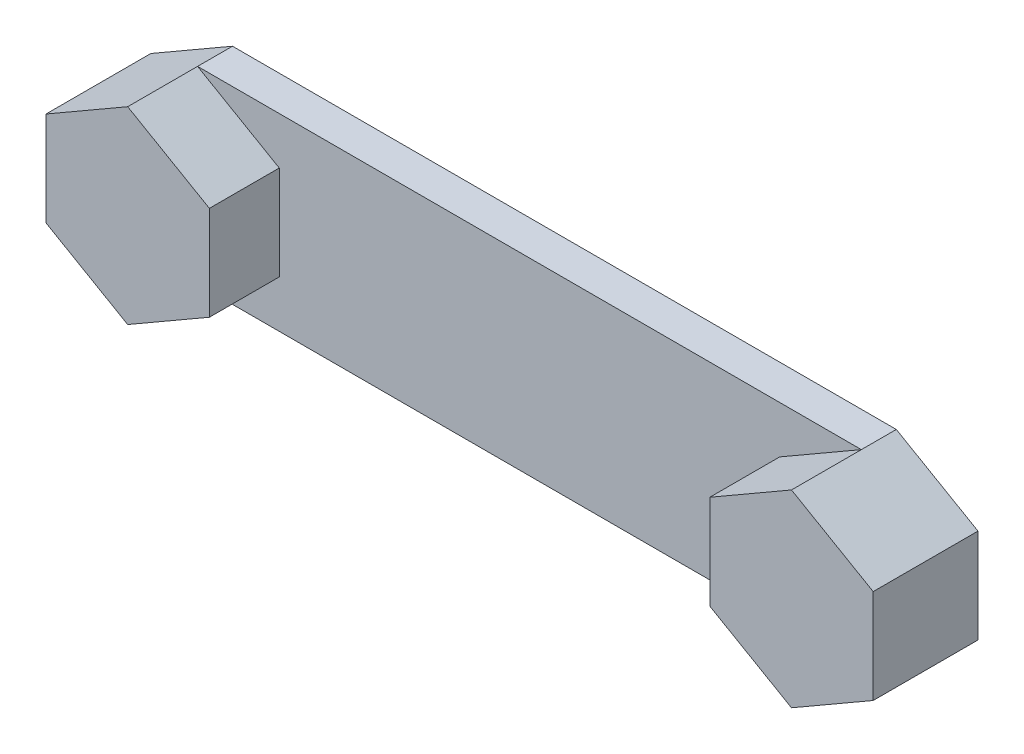
ISO-10303-21;
HEADER;
FILE_DESCRIPTION(('STEP AP214'),'2;1');
FILE_NAME('part.step','',(''),(''),'','','');
FILE_SCHEMA(('AUTOMOTIVE_DESIGN { 1 0 10303 214 1 1 1 1 }'));
ENDSEC;
DATA;
#1=APPLICATION_CONTEXT('core data for automotive mechanical design processes');
#2=APPLICATION_PROTOCOL_DEFINITION('international standard','automotive_design',2000,#1);
#3=PRODUCT_CONTEXT('',#1,'mechanical');
#4=PRODUCT('Part','Part','',(#3));
#5=PRODUCT_RELATED_PRODUCT_CATEGORY('part','',(#4));
#6=PRODUCT_DEFINITION_FORMATION('','',#4);
#7=PRODUCT_DEFINITION_CONTEXT('part definition',#1,'design');
#8=PRODUCT_DEFINITION('design','',#6,#7);
#9=PRODUCT_DEFINITION_SHAPE('','',#8);
#10=(LENGTH_UNIT() NAMED_UNIT(*) SI_UNIT(.MILLI.,.METRE.));
#11=(NAMED_UNIT(*) PLANE_ANGLE_UNIT() SI_UNIT($,.RADIAN.));
#12=(NAMED_UNIT(*) SI_UNIT($,.STERADIAN.) SOLID_ANGLE_UNIT());
#13=UNCERTAINTY_MEASURE_WITH_UNIT(LENGTH_MEASURE(1.E-05),#10,'distance_accuracy_value','');
#14=(GEOMETRIC_REPRESENTATION_CONTEXT(3) GLOBAL_UNCERTAINTY_ASSIGNED_CONTEXT((#13)) GLOBAL_UNIT_ASSIGNED_CONTEXT((#10,
#11,#12)) REPRESENTATION_CONTEXT('',''));
#15=CARTESIAN_POINT('',(0.,0.,0.));
#16=DIRECTION('',(0.,0.,1.));
#17=DIRECTION('',(1.,0.,0.));
#18=AXIS2_PLACEMENT_3D('',#15,#16,#17);
#19=CARTESIAN_POINT('',(0.,0.,0.));
#20=DIRECTION('',(0.,0.,-1.));
#21=DIRECTION('',(-1.,0.,0.));
#22=AXIS2_PLACEMENT_3D('',#19,#20,#21);
#23=PLANE('',#22);
#24=DIRECTION('',(0.866025403784438,-0.500000000000001,0.));
#25=VECTOR('',#24,1.);
#26=CARTESIAN_POINT('',(57.,-8.10000000000003,0.));
#27=LINE('',#26,#25);
#28=CARTESIAN_POINT('',(49.985194229346,-4.05000000000002,0.));
#29=VERTEX_POINT('',#28);
#30=CARTESIAN_POINT('',(57.,-8.10000000000003,0.));
#31=VERTEX_POINT('',#30);
#32=EDGE_CURVE('E61',#29,#31,#27,.T.);
#33=ORIENTED_EDGE('',*,*,#32,.F.);
#34=DIRECTION('',(0.,-1.,0.));
#35=VECTOR('',#34,1.);
#36=CARTESIAN_POINT('',(49.985194229346,-4.05000000000002,0.));
#37=LINE('',#36,#35);
#38=CARTESIAN_POINT('',(49.985194229346,4.05,0.));
#39=VERTEX_POINT('',#38);
#40=EDGE_CURVE('E298',#39,#29,#37,.T.);
#41=ORIENTED_EDGE('',*,*,#40,.F.);
#42=DIRECTION('',(-0.866025403784438,-0.500000000000001,0.));
#43=VECTOR('',#42,1.);
#44=CARTESIAN_POINT('',(49.985194229346,4.05,0.));
#45=LINE('',#44,#43);
#46=CARTESIAN_POINT('',(57.,8.10000000000001,0.));
#47=VERTEX_POINT('',#46);
#48=EDGE_CURVE('E297',#47,#39,#45,.T.);
#49=ORIENTED_EDGE('',*,*,#48,.F.);
#50=DIRECTION('',(1.,0.,0.));
#51=VECTOR('',#50,1.);
#52=CARTESIAN_POINT('',(0.,8.1,0.));
#53=LINE('',#52,#51);
#54=CARTESIAN_POINT('',(0.,8.1,0.));
#55=VERTEX_POINT('',#54);
#56=EDGE_CURVE('E207',#55,#47,#53,.T.);
#57=ORIENTED_EDGE('',*,*,#56,.F.);
#58=DIRECTION('',(-0.866025403784439,0.5,0.));
#59=VECTOR('',#58,1.);
#60=CARTESIAN_POINT('',(7.01480577065395,4.05,0.));
#61=LINE('',#60,#59);
#62=CARTESIAN_POINT('',(7.01480577065395,4.05,0.));
#63=VERTEX_POINT('',#62);
#64=EDGE_CURVE('E91',#63,#55,#61,.T.);
#65=ORIENTED_EDGE('',*,*,#64,.F.);
#66=DIRECTION('',(0.,1.,0.));
#67=VECTOR('',#66,1.);
#68=CARTESIAN_POINT('',(7.01480577065396,-4.05,0.));
#69=LINE('',#68,#67);
#70=CARTESIAN_POINT('',(7.01480577065396,-4.05,0.));
#71=VERTEX_POINT('',#70);
#72=EDGE_CURVE('E82',#71,#63,#69,.T.);
#73=ORIENTED_EDGE('',*,*,#72,.F.);
#74=DIRECTION('',(0.866025403784439,0.5,0.));
#75=VECTOR('',#74,1.);
#76=CARTESIAN_POINT('',(0.,-8.1,0.));
#77=LINE('',#76,#75);
#78=CARTESIAN_POINT('',(0.,-8.1,0.));
#79=VERTEX_POINT('',#78);
#80=EDGE_CURVE('E143',#79,#71,#77,.T.);
#81=ORIENTED_EDGE('',*,*,#80,.F.);
#82=DIRECTION('',(1.,0.,0.));
#83=VECTOR('',#82,1.);
#84=CARTESIAN_POINT('',(0.,-8.1,0.));
#85=LINE('',#84,#83);
#86=EDGE_CURVE('E204',#79,#31,#85,.T.);
#87=ORIENTED_EDGE('',*,*,#86,.T.);
#88=EDGE_LOOP('',(#33,#41,#49,#57,#65,#73,#81,#87));
#89=FACE_BOUND('',#88,.T.);
#90=ADVANCED_FACE('F45',(#89),#23,.F.);
#91=CARTESIAN_POINT('',(7.01480577065395,4.05,6.));
#92=DIRECTION('',(-0.5,-0.866025403784439,0.));
#93=DIRECTION('',(0.866025403784439,-0.5,0.));
#94=AXIS2_PLACEMENT_3D('',#91,#92,#93);
#95=PLANE('',#94);
#96=ORIENTED_EDGE('',*,*,#64,.T.);
#97=DIRECTION('',(0.,0.,-1.));
#98=VECTOR('',#97,1.);
#99=CARTESIAN_POINT('',(0.,8.1,6.));
#100=LINE('',#99,#98);
#101=CARTESIAN_POINT('',(0.,8.1,6.));
#102=VERTEX_POINT('',#101);
#103=EDGE_CURVE('E11',#102,#55,#100,.T.);
#104=ORIENTED_EDGE('',*,*,#103,.F.);
#105=DIRECTION('',(-0.866025403784439,0.5,0.));
#106=VECTOR('',#105,1.);
#107=CARTESIAN_POINT('',(7.01480577065395,4.05,6.));
#108=LINE('',#107,#106);
#109=CARTESIAN_POINT('',(7.01480577065395,4.05,6.));
#110=VERTEX_POINT('',#109);
#111=EDGE_CURVE('E148',#110,#102,#108,.T.);
#112=ORIENTED_EDGE('',*,*,#111,.F.);
#113=DIRECTION('',(0.,0.,-1.));
#114=VECTOR('',#113,1.);
#115=CARTESIAN_POINT('',(7.01480577065395,4.05,6.));
#116=LINE('',#115,#114);
#117=EDGE_CURVE('E137',#110,#63,#116,.T.);
#118=ORIENTED_EDGE('',*,*,#117,.T.);
#119=EDGE_LOOP('',(#96,#104,#112,#118));
#120=FACE_BOUND('',#119,.T.);
#121=ADVANCED_FACE('F47',(#120),#95,.F.);
#122=CARTESIAN_POINT('',(0.,8.1,6.));
#123=DIRECTION('',(0.5,-0.866025403784439,0.));
#124=DIRECTION('',(0.866025403784439,0.5,0.));
#125=AXIS2_PLACEMENT_3D('',#122,#123,#124);
#126=PLANE('',#125);
#127=ORIENTED_EDGE('',*,*,#103,.T.);
#128=DIRECTION('',(0.,0.,1.));
#129=VECTOR('',#128,1.);
#130=CARTESIAN_POINT('',(0.,8.1,-3.));
#131=LINE('',#130,#129);
#132=CARTESIAN_POINT('',(0.,8.1,-3.));
#133=VERTEX_POINT('',#132);
#134=EDGE_CURVE('E182',#133,#55,#131,.T.);
#135=ORIENTED_EDGE('',*,*,#134,.F.);
#136=DIRECTION('',(0.866025403784439,0.5,0.));
#137=VECTOR('',#136,1.);
#138=CARTESIAN_POINT('',(-3.50740288532698,6.075,-3.));
#139=LINE('',#138,#137);
#140=CARTESIAN_POINT('',(-7.01480577065396,4.05,-3.));
#141=VERTEX_POINT('',#140);
#142=EDGE_CURVE('E175',#141,#133,#139,.T.);
#143=ORIENTED_EDGE('',*,*,#142,.F.);
#144=DIRECTION('',(0.,0.,-1.));
#145=VECTOR('',#144,1.);
#146=CARTESIAN_POINT('',(-7.01480577065396,4.05,6.));
#147=LINE('',#146,#145);
#148=CARTESIAN_POINT('',(-7.01480577065396,4.05,6.));
#149=VERTEX_POINT('',#148);
#150=EDGE_CURVE('E54',#149,#141,#147,.T.);
#151=ORIENTED_EDGE('',*,*,#150,.F.);
#152=DIRECTION('',(-0.866025403784439,-0.5,0.));
#153=VECTOR('',#152,1.);
#154=CARTESIAN_POINT('',(0.,8.1,6.));
#155=LINE('',#154,#153);
#156=EDGE_CURVE('E234',#102,#149,#155,.T.);
#157=ORIENTED_EDGE('',*,*,#156,.F.);
#158=EDGE_LOOP('',(#127,#135,#143,#151,#157));
#159=FACE_BOUND('',#158,.T.);
#160=ADVANCED_FACE('F180',(#159),#126,.F.);
#161=CARTESIAN_POINT('',(-7.01480577065396,4.05,6.));
#162=DIRECTION('',(1.,0.,0.));
#163=DIRECTION('',(0.,1.,0.));
#164=AXIS2_PLACEMENT_3D('',#161,#162,#163);
#165=PLANE('',#164);
#166=ORIENTED_EDGE('',*,*,#150,.T.);
#167=DIRECTION('',(0.,1.,0.));
#168=VECTOR('',#167,1.);
#169=CARTESIAN_POINT('',(-7.01480577065396,0.,-3.));
#170=LINE('',#169,#168);
#171=CARTESIAN_POINT('',(-7.01480577065396,-4.05,-3.));
#172=VERTEX_POINT('',#171);
#173=EDGE_CURVE('E164',#172,#141,#170,.T.);
#174=ORIENTED_EDGE('',*,*,#173,.F.);
#175=DIRECTION('',(0.,0.,-1.));
#176=VECTOR('',#175,1.);
#177=CARTESIAN_POINT('',(-7.01480577065395,-4.05,6.));
#178=LINE('',#177,#176);
#179=CARTESIAN_POINT('',(-7.01480577065395,-4.05,6.));
#180=VERTEX_POINT('',#179);
#181=EDGE_CURVE('E129',#180,#172,#178,.T.);
#182=ORIENTED_EDGE('',*,*,#181,.F.);
#183=DIRECTION('',(0.,-1.,0.));
#184=VECTOR('',#183,1.);
#185=CARTESIAN_POINT('',(-7.01480577065396,4.05,6.));
#186=LINE('',#185,#184);
#187=EDGE_CURVE('E112',#149,#180,#186,.T.);
#188=ORIENTED_EDGE('',*,*,#187,.F.);
#189=EDGE_LOOP('',(#166,#174,#182,#188));
#190=FACE_BOUND('',#189,.T.);
#191=ADVANCED_FACE('F162',(#190),#165,.F.);
#192=CARTESIAN_POINT('',(-7.01480577065395,-4.05,6.));
#193=DIRECTION('',(0.5,0.866025403784439,0.));
#194=DIRECTION('',(-0.866025403784439,0.5,0.));
#195=AXIS2_PLACEMENT_3D('',#192,#193,#194);
#196=PLANE('',#195);
#197=ORIENTED_EDGE('',*,*,#181,.T.);
#198=DIRECTION('',(-0.866025403784439,0.5,0.));
#199=VECTOR('',#198,1.);
#200=CARTESIAN_POINT('',(-3.50740288532698,-6.075,-3.));
#201=LINE('',#200,#199);
#202=CARTESIAN_POINT('',(0.,-8.1,-3.));
#203=VERTEX_POINT('',#202);
#204=EDGE_CURVE('E177',#203,#172,#201,.T.);
#205=ORIENTED_EDGE('',*,*,#204,.F.);
#206=DIRECTION('',(0.,0.,1.));
#207=VECTOR('',#206,1.);
#208=CARTESIAN_POINT('',(0.,-8.1,-3.));
#209=LINE('',#208,#207);
#210=EDGE_CURVE('E125',#203,#79,#209,.T.);
#211=ORIENTED_EDGE('',*,*,#210,.T.);
#212=DIRECTION('',(0.,0.,-1.));
#213=VECTOR('',#212,1.);
#214=CARTESIAN_POINT('',(0.,-8.1,6.));
#215=LINE('',#214,#213);
#216=CARTESIAN_POINT('',(0.,-8.1,6.));
#217=VERTEX_POINT('',#216);
#218=EDGE_CURVE('E120',#217,#79,#215,.T.);
#219=ORIENTED_EDGE('',*,*,#218,.F.);
#220=DIRECTION('',(0.866025403784439,-0.5,0.));
#221=VECTOR('',#220,1.);
#222=CARTESIAN_POINT('',(-7.01480577065395,-4.05,6.));
#223=LINE('',#222,#221);
#224=EDGE_CURVE('E105',#180,#217,#223,.T.);
#225=ORIENTED_EDGE('',*,*,#224,.F.);
#226=EDGE_LOOP('',(#197,#205,#211,#219,#225));
#227=FACE_BOUND('',#226,.T.);
#228=ADVANCED_FACE('F121',(#227),#196,.F.);
#229=CARTESIAN_POINT('',(0.,-8.1,6.));
#230=DIRECTION('',(-0.5,0.866025403784438,0.));
#231=DIRECTION('',(-0.866025403784439,-0.5,0.));
#232=AXIS2_PLACEMENT_3D('',#229,#230,#231);
#233=PLANE('',#232);
#234=ORIENTED_EDGE('',*,*,#80,.T.);
#235=DIRECTION('',(0.,0.,-1.));
#236=VECTOR('',#235,1.);
#237=CARTESIAN_POINT('',(7.01480577065396,-4.05,6.));
#238=LINE('',#237,#236);
#239=CARTESIAN_POINT('',(7.01480577065396,-4.05,6.));
#240=VERTEX_POINT('',#239);
#241=EDGE_CURVE('E130',#240,#71,#238,.T.);
#242=ORIENTED_EDGE('',*,*,#241,.F.);
#243=DIRECTION('',(0.866025403784439,0.5,0.));
#244=VECTOR('',#243,1.);
#245=CARTESIAN_POINT('',(0.,-8.1,6.));
#246=LINE('',#245,#244);
#247=EDGE_CURVE('E109',#217,#240,#246,.T.);
#248=ORIENTED_EDGE('',*,*,#247,.F.);
#249=ORIENTED_EDGE('',*,*,#218,.T.);
#250=EDGE_LOOP('',(#234,#242,#248,#249));
#251=FACE_BOUND('',#250,.T.);
#252=ADVANCED_FACE('F132',(#251),#233,.F.);
#253=CARTESIAN_POINT('',(7.01480577065396,-4.05,6.));
#254=DIRECTION('',(-1.,0.,0.));
#255=DIRECTION('',(0.,-1.,0.));
#256=AXIS2_PLACEMENT_3D('',#253,#254,#255);
#257=PLANE('',#256);
#258=ORIENTED_EDGE('',*,*,#72,.T.);
#259=ORIENTED_EDGE('',*,*,#117,.F.);
#260=DIRECTION('',(0.,1.,0.));
#261=VECTOR('',#260,1.);
#262=CARTESIAN_POINT('',(7.01480577065396,-4.05,6.));
#263=LINE('',#262,#261);
#264=EDGE_CURVE('E70',#240,#110,#263,.T.);
#265=ORIENTED_EDGE('',*,*,#264,.F.);
#266=ORIENTED_EDGE('',*,*,#241,.T.);
#267=EDGE_LOOP('',(#258,#259,#265,#266));
#268=FACE_BOUND('',#267,.T.);
#269=ADVANCED_FACE('F244',(#268),#257,.F.);
#270=CARTESIAN_POINT('',(0.,0.,6.));
#271=DIRECTION('',(0.,0.,1.));
#272=DIRECTION('',(1.,0.,0.));
#273=AXIS2_PLACEMENT_3D('',#270,#271,#272);
#274=PLANE('',#273);
#275=ORIENTED_EDGE('',*,*,#111,.T.);
#276=ORIENTED_EDGE('',*,*,#156,.T.);
#277=ORIENTED_EDGE('',*,*,#187,.T.);
#278=ORIENTED_EDGE('',*,*,#224,.T.);
#279=ORIENTED_EDGE('',*,*,#247,.T.);
#280=ORIENTED_EDGE('',*,*,#264,.T.);
#281=EDGE_LOOP('',(#275,#276,#277,#278,#279,#280));
#282=FACE_BOUND('',#281,.T.);
#283=ADVANCED_FACE('F107',(#282),#274,.T.);
#284=CARTESIAN_POINT('',(0.,-8.1,-3.));
#285=DIRECTION('',(0.,-1.,0.));
#286=DIRECTION('',(1.,0.,0.));
#287=AXIS2_PLACEMENT_3D('',#284,#285,#286);
#288=PLANE('',#287);
#289=ORIENTED_EDGE('',*,*,#86,.F.);
#290=ORIENTED_EDGE('',*,*,#210,.F.);
#291=DIRECTION('',(1.,0.,0.));
#292=VECTOR('',#291,1.);
#293=CARTESIAN_POINT('',(0.,-8.1,-3.));
#294=LINE('',#293,#292);
#295=CARTESIAN_POINT('',(57.,-8.10000000000003,-3.));
#296=VERTEX_POINT('',#295);
#297=EDGE_CURVE('E212',#203,#296,#294,.T.);
#298=ORIENTED_EDGE('',*,*,#297,.T.);
#299=DIRECTION('',(0.,0.,1.));
#300=VECTOR('',#299,1.);
#301=CARTESIAN_POINT('',(57.,-8.10000000000003,-3.));
#302=LINE('',#301,#300);
#303=EDGE_CURVE('E203',#296,#31,#302,.T.);
#304=ORIENTED_EDGE('',*,*,#303,.T.);
#305=EDGE_LOOP('',(#289,#290,#298,#304));
#306=FACE_BOUND('',#305,.T.);
#307=ADVANCED_FACE('F251',(#306),#288,.T.);
#308=CARTESIAN_POINT('',(0.,8.1,-3.));
#309=DIRECTION('',(0.,-1.,0.));
#310=DIRECTION('',(1.,0.,0.));
#311=AXIS2_PLACEMENT_3D('',#308,#309,#310);
#312=PLANE('',#311);
#313=ORIENTED_EDGE('',*,*,#56,.T.);
#314=DIRECTION('',(0.,0.,1.));
#315=VECTOR('',#314,1.);
#316=CARTESIAN_POINT('',(57.,8.10000000000001,-3.));
#317=LINE('',#316,#315);
#318=CARTESIAN_POINT('',(57.,8.10000000000001,-3.));
#319=VERTEX_POINT('',#318);
#320=EDGE_CURVE('E224',#319,#47,#317,.T.);
#321=ORIENTED_EDGE('',*,*,#320,.F.);
#322=DIRECTION('',(1.,0.,0.));
#323=VECTOR('',#322,1.);
#324=CARTESIAN_POINT('',(0.,8.1,-3.));
#325=LINE('',#324,#323);
#326=EDGE_CURVE('E185',#133,#319,#325,.T.);
#327=ORIENTED_EDGE('',*,*,#326,.F.);
#328=ORIENTED_EDGE('',*,*,#134,.T.);
#329=EDGE_LOOP('',(#313,#321,#327,#328));
#330=FACE_BOUND('',#329,.T.);
#331=ADVANCED_FACE('F273',(#330),#312,.F.);
#332=CARTESIAN_POINT('',(17.757402885327,30.7567240078565,-3.));
#333=DIRECTION('',(0.500000000000001,0.866025403784438,0.));
#334=DIRECTION('',(-0.866025403784438,0.500000000000001,0.));
#335=AXIS2_PLACEMENT_3D('',#332,#333,#334);
#336=PLANE('',#335);
#337=ORIENTED_EDGE('',*,*,#320,.T.);
#338=DIRECTION('',(0.,0.,-1.));
#339=VECTOR('',#338,1.);
#340=CARTESIAN_POINT('',(57.,8.10000000000001,6.));
#341=LINE('',#340,#339);
#342=CARTESIAN_POINT('',(57.,8.10000000000001,6.));
#343=VERTEX_POINT('',#342);
#344=EDGE_CURVE('E303',#343,#47,#341,.T.);
#345=ORIENTED_EDGE('',*,*,#344,.F.);
#346=DIRECTION('',(-0.866025403784438,0.500000000000001,0.));
#347=VECTOR('',#346,1.);
#348=CARTESIAN_POINT('',(64.014805770654,4.05,6.));
#349=LINE('',#348,#347);
#350=CARTESIAN_POINT('',(64.014805770654,4.05,6.));
#351=VERTEX_POINT('',#350);
#352=EDGE_CURVE('E351',#351,#343,#349,.T.);
#353=ORIENTED_EDGE('',*,*,#352,.F.);
#354=DIRECTION('',(0.,0.,1.));
#355=VECTOR('',#354,1.);
#356=CARTESIAN_POINT('',(64.014805770654,4.05,-3.));
#357=LINE('',#356,#355);
#358=CARTESIAN_POINT('',(64.014805770654,4.05,-3.));
#359=VERTEX_POINT('',#358);
#360=EDGE_CURVE('E220',#359,#351,#357,.T.);
#361=ORIENTED_EDGE('',*,*,#360,.F.);
#362=DIRECTION('',(-0.866025403784438,0.5,0.));
#363=VECTOR('',#362,1.);
#364=CARTESIAN_POINT('',(17.757402885327,30.7567240078565,-3.));
#365=LINE('',#364,#363);
#366=EDGE_CURVE('E188',#359,#319,#365,.T.);
#367=ORIENTED_EDGE('',*,*,#366,.T.);
#368=EDGE_LOOP('',(#337,#345,#353,#361,#367));
#369=FACE_BOUND('',#368,.T.);
#370=ADVANCED_FACE('F269',(#369),#336,.T.);
#371=CARTESIAN_POINT('',(64.014805770654,0.,-3.));
#372=DIRECTION('',(1.,0.,0.));
#373=DIRECTION('',(0.,0.,-1.));
#374=AXIS2_PLACEMENT_3D('',#371,#372,#373);
#375=PLANE('',#374);
#376=ORIENTED_EDGE('',*,*,#360,.T.);
#377=DIRECTION('',(0.,1.,0.));
#378=VECTOR('',#377,1.);
#379=CARTESIAN_POINT('',(64.014805770654,-4.05000000000002,6.));
#380=LINE('',#379,#378);
#381=CARTESIAN_POINT('',(64.014805770654,-4.05000000000002,6.));
#382=VERTEX_POINT('',#381);
#383=EDGE_CURVE('E355',#382,#351,#380,.T.);
#384=ORIENTED_EDGE('',*,*,#383,.F.);
#385=DIRECTION('',(0.,0.,1.));
#386=VECTOR('',#385,1.);
#387=CARTESIAN_POINT('',(64.014805770654,-4.05000000000002,-3.));
#388=LINE('',#387,#386);
#389=CARTESIAN_POINT('',(64.014805770654,-4.05000000000002,-3.));
#390=VERTEX_POINT('',#389);
#391=EDGE_CURVE('E216',#390,#382,#388,.T.);
#392=ORIENTED_EDGE('',*,*,#391,.F.);
#393=DIRECTION('',(0.,1.,0.));
#394=VECTOR('',#393,1.);
#395=CARTESIAN_POINT('',(64.014805770654,0.,-3.));
#396=LINE('',#395,#394);
#397=EDGE_CURVE('E195',#390,#359,#396,.T.);
#398=ORIENTED_EDGE('',*,*,#397,.T.);
#399=EDGE_LOOP('',(#376,#384,#392,#398));
#400=FACE_BOUND('',#399,.T.);
#401=ADVANCED_FACE('F265',(#400),#375,.T.);
#402=CARTESIAN_POINT('',(17.7574028853269,-30.7567240078565,-3.));
#403=DIRECTION('',(0.499999999999999,-0.866025403784439,0.));
#404=DIRECTION('',(0.866025403784439,0.499999999999999,0.));
#405=AXIS2_PLACEMENT_3D('',#402,#403,#404);
#406=PLANE('',#405);
#407=ORIENTED_EDGE('',*,*,#391,.T.);
#408=DIRECTION('',(0.866025403784439,0.499999999999999,0.));
#409=VECTOR('',#408,1.);
#410=CARTESIAN_POINT('',(57.,-8.10000000000003,6.));
#411=LINE('',#410,#409);
#412=CARTESIAN_POINT('',(57.,-8.10000000000003,6.));
#413=VERTEX_POINT('',#412);
#414=EDGE_CURVE('E301',#413,#382,#411,.T.);
#415=ORIENTED_EDGE('',*,*,#414,.F.);
#416=DIRECTION('',(0.,0.,-1.));
#417=VECTOR('',#416,1.);
#418=CARTESIAN_POINT('',(57.,-8.10000000000003,6.));
#419=LINE('',#418,#417);
#420=EDGE_CURVE('E292',#413,#31,#419,.T.);
#421=ORIENTED_EDGE('',*,*,#420,.T.);
#422=ORIENTED_EDGE('',*,*,#303,.F.);
#423=DIRECTION('',(0.866025403784439,0.499999999999999,0.));
#424=VECTOR('',#423,1.);
#425=CARTESIAN_POINT('',(17.7574028853269,-30.7567240078565,-3.));
#426=LINE('',#425,#424);
#427=EDGE_CURVE('E199',#296,#390,#426,.T.);
#428=ORIENTED_EDGE('',*,*,#427,.T.);
#429=EDGE_LOOP('',(#407,#415,#421,#422,#428));
#430=FACE_BOUND('',#429,.T.);
#431=ADVANCED_FACE('F262',(#430),#406,.T.);
#432=CARTESIAN_POINT('',(0.,0.,-3.));
#433=DIRECTION('',(0.,0.,-1.));
#434=DIRECTION('',(-1.,0.,0.));
#435=AXIS2_PLACEMENT_3D('',#432,#433,#434);
#436=PLANE('',#435);
#437=ORIENTED_EDGE('',*,*,#297,.F.);
#438=ORIENTED_EDGE('',*,*,#204,.T.);
#439=ORIENTED_EDGE('',*,*,#173,.T.);
#440=ORIENTED_EDGE('',*,*,#142,.T.);
#441=ORIENTED_EDGE('',*,*,#326,.T.);
#442=ORIENTED_EDGE('',*,*,#366,.F.);
#443=ORIENTED_EDGE('',*,*,#397,.F.);
#444=ORIENTED_EDGE('',*,*,#427,.F.);
#445=EDGE_LOOP('',(#437,#438,#439,#440,#441,#442,#443,#444));
#446=FACE_BOUND('',#445,.T.);
#447=ADVANCED_FACE('F173',(#446),#436,.T.);
#448=CARTESIAN_POINT('',(49.985194229346,-4.05000000000002,6.));
#449=DIRECTION('',(1.,0.,0.));
#450=DIRECTION('',(0.,0.,-1.));
#451=AXIS2_PLACEMENT_3D('',#448,#449,#450);
#452=PLANE('',#451);
#453=ORIENTED_EDGE('',*,*,#40,.T.);
#454=DIRECTION('',(0.,0.,-1.));
#455=VECTOR('',#454,1.);
#456=CARTESIAN_POINT('',(49.985194229346,-4.05000000000002,6.));
#457=LINE('',#456,#455);
#458=CARTESIAN_POINT('',(49.985194229346,-4.05000000000002,6.));
#459=VERTEX_POINT('',#458);
#460=EDGE_CURVE('E208',#459,#29,#457,.T.);
#461=ORIENTED_EDGE('',*,*,#460,.F.);
#462=DIRECTION('',(0.,-1.,0.));
#463=VECTOR('',#462,1.);
#464=CARTESIAN_POINT('',(49.985194229346,-4.05000000000002,6.));
#465=LINE('',#464,#463);
#466=CARTESIAN_POINT('',(49.985194229346,4.05,6.));
#467=VERTEX_POINT('',#466);
#468=EDGE_CURVE('E334',#467,#459,#465,.T.);
#469=ORIENTED_EDGE('',*,*,#468,.F.);
#470=DIRECTION('',(0.,0.,-1.));
#471=VECTOR('',#470,1.);
#472=CARTESIAN_POINT('',(49.985194229346,4.05,6.));
#473=LINE('',#472,#471);
#474=EDGE_CURVE('E309',#467,#39,#473,.T.);
#475=ORIENTED_EDGE('',*,*,#474,.T.);
#476=EDGE_LOOP('',(#453,#461,#469,#475));
#477=FACE_BOUND('',#476,.T.);
#478=ADVANCED_FACE('F361',(#477),#452,.F.);
#479=CARTESIAN_POINT('',(57.,-8.10000000000003,6.));
#480=DIRECTION('',(0.5,0.866025403784438,0.));
#481=DIRECTION('',(-0.866025403784438,0.500000000000001,0.));
#482=AXIS2_PLACEMENT_3D('',#479,#480,#481);
#483=PLANE('',#482);
#484=ORIENTED_EDGE('',*,*,#32,.T.);
#485=ORIENTED_EDGE('',*,*,#420,.F.);
#486=DIRECTION('',(0.866025403784438,-0.500000000000001,0.));
#487=VECTOR('',#486,1.);
#488=CARTESIAN_POINT('',(57.,-8.10000000000003,6.));
#489=LINE('',#488,#487);
#490=EDGE_CURVE('E375',#459,#413,#489,.T.);
#491=ORIENTED_EDGE('',*,*,#490,.F.);
#492=ORIENTED_EDGE('',*,*,#460,.T.);
#493=EDGE_LOOP('',(#484,#485,#491,#492));
#494=FACE_BOUND('',#493,.T.);
#495=ADVANCED_FACE('F289',(#494),#483,.F.);
#496=CARTESIAN_POINT('',(49.985194229346,4.05,6.));
#497=DIRECTION('',(0.500000000000001,-0.866025403784438,0.));
#498=DIRECTION('',(0.866025403784438,0.500000000000001,0.));
#499=AXIS2_PLACEMENT_3D('',#496,#497,#498);
#500=PLANE('',#499);
#501=ORIENTED_EDGE('',*,*,#48,.T.);
#502=ORIENTED_EDGE('',*,*,#474,.F.);
#503=DIRECTION('',(-0.866025403784438,-0.500000000000001,0.));
#504=VECTOR('',#503,1.);
#505=CARTESIAN_POINT('',(49.985194229346,4.05,6.));
#506=LINE('',#505,#504);
#507=EDGE_CURVE('E343',#343,#467,#506,.T.);
#508=ORIENTED_EDGE('',*,*,#507,.F.);
#509=ORIENTED_EDGE('',*,*,#344,.T.);
#510=EDGE_LOOP('',(#501,#502,#508,#509));
#511=FACE_BOUND('',#510,.T.);
#512=ADVANCED_FACE('F341',(#511),#500,.F.);
#513=CARTESIAN_POINT('',(0.,0.,6.));
#514=DIRECTION('',(0.,0.,-1.));
#515=DIRECTION('',(-1.,0.,0.));
#516=AXIS2_PLACEMENT_3D('',#513,#514,#515);
#517=PLANE('',#516);
#518=ORIENTED_EDGE('',*,*,#468,.T.);
#519=ORIENTED_EDGE('',*,*,#490,.T.);
#520=ORIENTED_EDGE('',*,*,#414,.T.);
#521=ORIENTED_EDGE('',*,*,#383,.T.);
#522=ORIENTED_EDGE('',*,*,#352,.T.);
#523=ORIENTED_EDGE('',*,*,#507,.T.);
#524=EDGE_LOOP('',(#518,#519,#520,#521,#522,#523));
#525=FACE_BOUND('',#524,.T.);
#526=ADVANCED_FACE('F371',(#525),#517,.F.);
#527=CLOSED_SHELL('',(#90,#121,#160,#191,#228,#252,#269,#283,#307,#331,#370,#401,#431,#447,#478,
#495,#512,#526));
#528=MANIFOLD_SOLID_BREP('B2',#527);
#529=ADVANCED_BREP_SHAPE_REPRESENTATION('',(#18,#528),#14);
#530=SHAPE_DEFINITION_REPRESENTATION(#9,#529);
ENDSEC;
END-ISO-10303-21;
